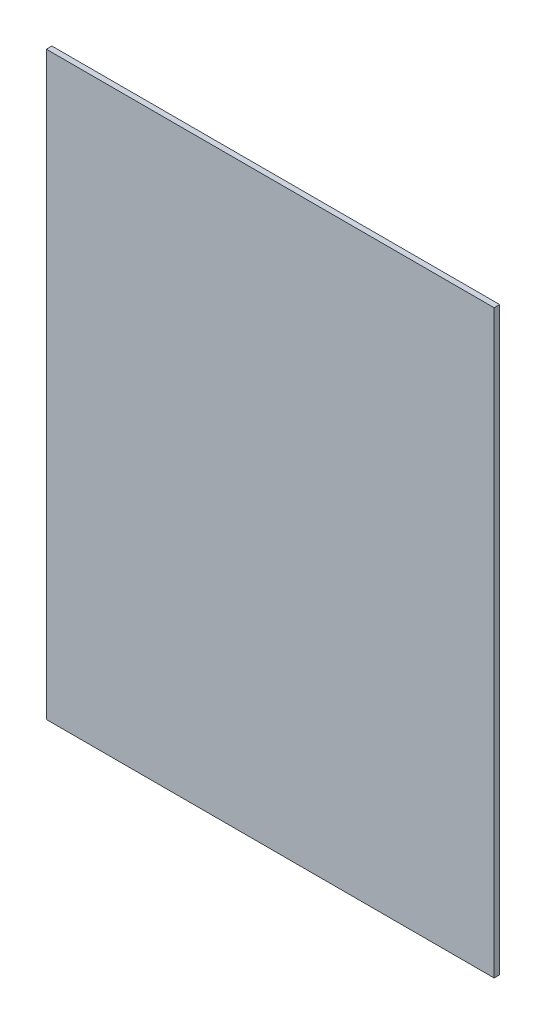
ISO-10303-21;
HEADER;
FILE_DESCRIPTION(('STEP AP214'),'2;1');
FILE_NAME('part.step','',(''),(''),'','','');
FILE_SCHEMA(('AUTOMOTIVE_DESIGN { 1 0 10303 214 1 1 1 1 }'));
ENDSEC;
DATA;
#1=APPLICATION_CONTEXT('core data for automotive mechanical design processes');
#2=APPLICATION_PROTOCOL_DEFINITION('international standard','automotive_design',2000,#1);
#3=PRODUCT_CONTEXT('',#1,'mechanical');
#4=PRODUCT('Part','Part','',(#3));
#5=PRODUCT_RELATED_PRODUCT_CATEGORY('part','',(#4));
#6=PRODUCT_DEFINITION_FORMATION('','',#4);
#7=PRODUCT_DEFINITION_CONTEXT('part definition',#1,'design');
#8=PRODUCT_DEFINITION('design','',#6,#7);
#9=PRODUCT_DEFINITION_SHAPE('','',#8);
#10=(LENGTH_UNIT() NAMED_UNIT(*) SI_UNIT(.MILLI.,.METRE.));
#11=(NAMED_UNIT(*) PLANE_ANGLE_UNIT() SI_UNIT($,.RADIAN.));
#12=(NAMED_UNIT(*) SI_UNIT($,.STERADIAN.) SOLID_ANGLE_UNIT());
#13=UNCERTAINTY_MEASURE_WITH_UNIT(LENGTH_MEASURE(1.E-05),#10,'distance_accuracy_value','');
#14=(GEOMETRIC_REPRESENTATION_CONTEXT(3) GLOBAL_UNCERTAINTY_ASSIGNED_CONTEXT((#13)) GLOBAL_UNIT_ASSIGNED_CONTEXT((#10,
#11,#12)) REPRESENTATION_CONTEXT('',''));
#15=CARTESIAN_POINT('',(0.,0.,0.));
#16=DIRECTION('',(0.,0.,1.));
#17=DIRECTION('',(1.,0.,0.));
#18=AXIS2_PLACEMENT_3D('',#15,#16,#17);
#19=CARTESIAN_POINT('',(81.,-105.,2.));
#20=DIRECTION('',(-1.,0.,0.));
#21=DIRECTION('',(0.,0.,1.));
#22=AXIS2_PLACEMENT_3D('',#19,#20,#21);
#23=PLANE('',#22);
#24=DIRECTION('',(0.,1.,0.));
#25=VECTOR('',#24,1.);
#26=CARTESIAN_POINT('',(81.,-105.,0.));
#27=LINE('',#26,#25);
#28=CARTESIAN_POINT('',(81.,-105.,0.));
#29=VERTEX_POINT('',#28);
#30=CARTESIAN_POINT('',(81.,105.,0.));
#31=VERTEX_POINT('',#30);
#32=EDGE_CURVE('E96',#29,#31,#27,.T.);
#33=ORIENTED_EDGE('',*,*,#32,.T.);
#34=DIRECTION('',(0.,0.,-1.));
#35=VECTOR('',#34,1.);
#36=CARTESIAN_POINT('',(81.,105.,2.));
#37=LINE('',#36,#35);
#38=CARTESIAN_POINT('',(81.,105.,2.));
#39=VERTEX_POINT('',#38);
#40=EDGE_CURVE('E11',#39,#31,#37,.T.);
#41=ORIENTED_EDGE('',*,*,#40,.F.);
#42=DIRECTION('',(0.,1.,0.));
#43=VECTOR('',#42,1.);
#44=CARTESIAN_POINT('',(81.,-105.,2.));
#45=LINE('',#44,#43);
#46=CARTESIAN_POINT('',(81.,-105.,2.));
#47=VERTEX_POINT('',#46);
#48=EDGE_CURVE('E84',#47,#39,#45,.T.);
#49=ORIENTED_EDGE('',*,*,#48,.F.);
#50=DIRECTION('',(0.,0.,-1.));
#51=VECTOR('',#50,1.);
#52=CARTESIAN_POINT('',(81.,-105.,2.));
#53=LINE('',#52,#51);
#54=EDGE_CURVE('E92',#47,#29,#53,.T.);
#55=ORIENTED_EDGE('',*,*,#54,.T.);
#56=EDGE_LOOP('',(#33,#41,#49,#55));
#57=FACE_BOUND('',#56,.T.);
#58=ADVANCED_FACE('F33',(#57),#23,.F.);
#59=CARTESIAN_POINT('',(-81.,105.,2.));
#60=DIRECTION('',(0.,-1.,0.));
#61=DIRECTION('',(0.,0.,-1.));
#62=AXIS2_PLACEMENT_3D('',#59,#60,#61);
#63=PLANE('',#62);
#64=DIRECTION('',(-1.,0.,0.));
#65=VECTOR('',#64,1.);
#66=CARTESIAN_POINT('',(-81.,105.,0.));
#67=LINE('',#66,#65);
#68=CARTESIAN_POINT('',(-81.,105.,0.));
#69=VERTEX_POINT('',#68);
#70=EDGE_CURVE('E88',#31,#69,#67,.T.);
#71=ORIENTED_EDGE('',*,*,#70,.T.);
#72=DIRECTION('',(0.,0.,-1.));
#73=VECTOR('',#72,1.);
#74=CARTESIAN_POINT('',(-81.,105.,2.));
#75=LINE('',#74,#73);
#76=CARTESIAN_POINT('',(-81.,105.,2.));
#77=VERTEX_POINT('',#76);
#78=EDGE_CURVE('E41',#77,#69,#75,.T.);
#79=ORIENTED_EDGE('',*,*,#78,.F.);
#80=DIRECTION('',(-1.,0.,0.));
#81=VECTOR('',#80,1.);
#82=CARTESIAN_POINT('',(-81.,105.,2.));
#83=LINE('',#82,#81);
#84=EDGE_CURVE('E79',#39,#77,#83,.T.);
#85=ORIENTED_EDGE('',*,*,#84,.F.);
#86=ORIENTED_EDGE('',*,*,#40,.T.);
#87=EDGE_LOOP('',(#71,#79,#85,#86));
#88=FACE_BOUND('',#87,.T.);
#89=ADVANCED_FACE('F87',(#88),#63,.F.);
#90=CARTESIAN_POINT('',(-81.,-105.,2.));
#91=DIRECTION('',(1.,0.,0.));
#92=DIRECTION('',(0.,0.,-1.));
#93=AXIS2_PLACEMENT_3D('',#90,#91,#92);
#94=PLANE('',#93);
#95=DIRECTION('',(0.,-1.,0.));
#96=VECTOR('',#95,1.);
#97=CARTESIAN_POINT('',(-81.,-105.,0.));
#98=LINE('',#97,#96);
#99=CARTESIAN_POINT('',(-81.,-105.,0.));
#100=VERTEX_POINT('',#99);
#101=EDGE_CURVE('E66',#69,#100,#98,.T.);
#102=ORIENTED_EDGE('',*,*,#101,.T.);
#103=DIRECTION('',(0.,0.,-1.));
#104=VECTOR('',#103,1.);
#105=CARTESIAN_POINT('',(-81.,-105.,2.));
#106=LINE('',#105,#104);
#107=CARTESIAN_POINT('',(-81.,-105.,2.));
#108=VERTEX_POINT('',#107);
#109=EDGE_CURVE('E89',#108,#100,#106,.T.);
#110=ORIENTED_EDGE('',*,*,#109,.F.);
#111=DIRECTION('',(0.,-1.,0.));
#112=VECTOR('',#111,1.);
#113=CARTESIAN_POINT('',(-81.,-105.,2.));
#114=LINE('',#113,#112);
#115=EDGE_CURVE('E82',#77,#108,#114,.T.);
#116=ORIENTED_EDGE('',*,*,#115,.F.);
#117=ORIENTED_EDGE('',*,*,#78,.T.);
#118=EDGE_LOOP('',(#102,#110,#116,#117));
#119=FACE_BOUND('',#118,.T.);
#120=ADVANCED_FACE('F90',(#119),#94,.F.);
#121=CARTESIAN_POINT('',(-81.,-105.,2.));
#122=DIRECTION('',(0.,1.,0.));
#123=DIRECTION('',(0.,0.,1.));
#124=AXIS2_PLACEMENT_3D('',#121,#122,#123);
#125=PLANE('',#124);
#126=DIRECTION('',(1.,0.,0.));
#127=VECTOR('',#126,1.);
#128=CARTESIAN_POINT('',(-81.,-105.,0.));
#129=LINE('',#128,#127);
#130=EDGE_CURVE('E72',#100,#29,#129,.T.);
#131=ORIENTED_EDGE('',*,*,#130,.T.);
#132=ORIENTED_EDGE('',*,*,#54,.F.);
#133=DIRECTION('',(1.,0.,0.));
#134=VECTOR('',#133,1.);
#135=CARTESIAN_POINT('',(-81.,-105.,2.));
#136=LINE('',#135,#134);
#137=EDGE_CURVE('E49',#108,#47,#136,.T.);
#138=ORIENTED_EDGE('',*,*,#137,.F.);
#139=ORIENTED_EDGE('',*,*,#109,.T.);
#140=EDGE_LOOP('',(#131,#132,#138,#139));
#141=FACE_BOUND('',#140,.T.);
#142=ADVANCED_FACE('F103',(#141),#125,.F.);
#143=CARTESIAN_POINT('',(0.,0.,2.));
#144=DIRECTION('',(0.,0.,-1.));
#145=DIRECTION('',(-1.,0.,0.));
#146=AXIS2_PLACEMENT_3D('',#143,#144,#145);
#147=PLANE('',#146);
#148=ORIENTED_EDGE('',*,*,#48,.T.);
#149=ORIENTED_EDGE('',*,*,#84,.T.);
#150=ORIENTED_EDGE('',*,*,#115,.T.);
#151=ORIENTED_EDGE('',*,*,#137,.T.);
#152=EDGE_LOOP('',(#148,#149,#150,#151));
#153=FACE_BOUND('',#152,.T.);
#154=ADVANCED_FACE('F80',(#153),#147,.F.);
#155=CARTESIAN_POINT('',(0.,0.,0.));
#156=DIRECTION('',(0.,0.,-1.));
#157=DIRECTION('',(-1.,0.,0.));
#158=AXIS2_PLACEMENT_3D('',#155,#156,#157);
#159=PLANE('',#158);
#160=ORIENTED_EDGE('',*,*,#32,.F.);
#161=ORIENTED_EDGE('',*,*,#130,.F.);
#162=ORIENTED_EDGE('',*,*,#101,.F.);
#163=ORIENTED_EDGE('',*,*,#70,.F.);
#164=EDGE_LOOP('',(#160,#161,#162,#163));
#165=FACE_BOUND('',#164,.T.);
#166=ADVANCED_FACE('F106',(#165),#159,.T.);
#167=CLOSED_SHELL('',(#58,#89,#120,#142,#154,#166));
#168=MANIFOLD_SOLID_BREP('B2',#167);
#169=ADVANCED_BREP_SHAPE_REPRESENTATION('',(#18,#168),#14);
#170=SHAPE_DEFINITION_REPRESENTATION(#9,#169);
ENDSEC;
END-ISO-10303-21;
